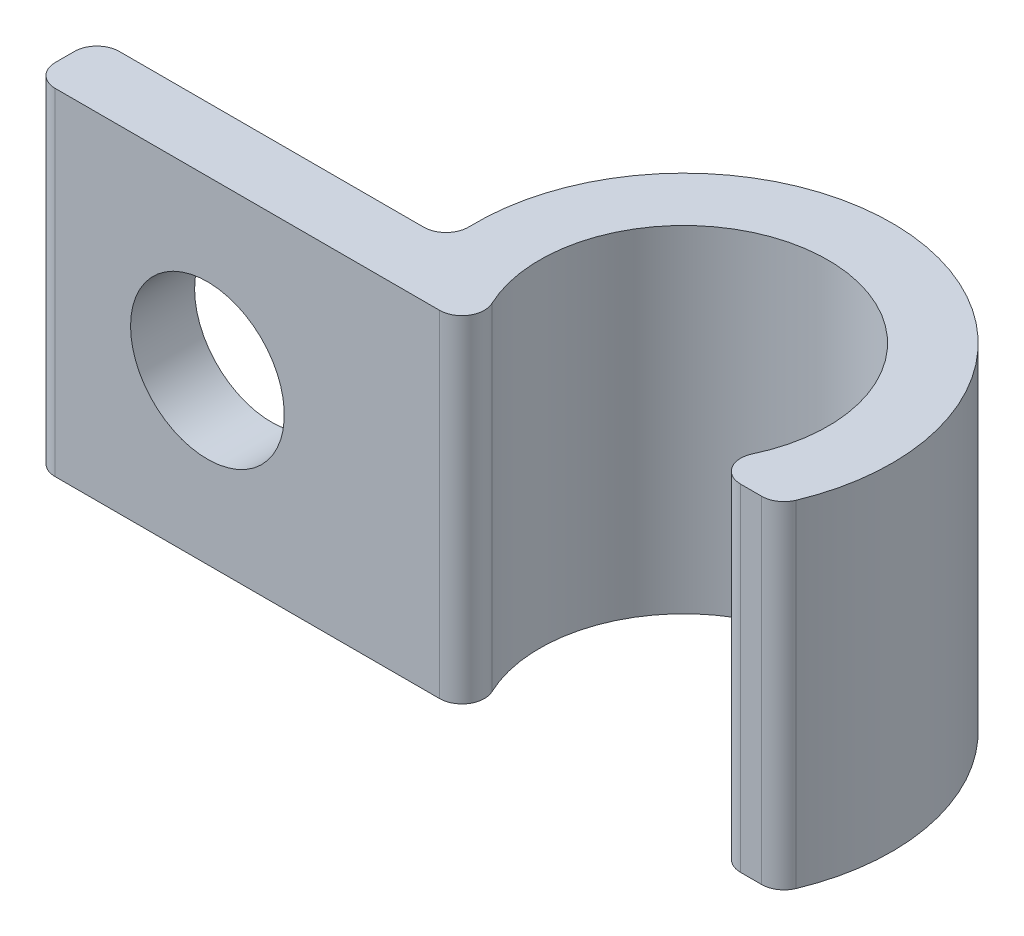
ISO-10303-21;
HEADER;
FILE_DESCRIPTION(('STEP AP214'),'2;1');
FILE_NAME('part.step','',(''),(''),'','','');
FILE_SCHEMA(('AUTOMOTIVE_DESIGN { 1 0 10303 214 1 1 1 1 }'));
ENDSEC;
DATA;
#1=APPLICATION_CONTEXT('core data for automotive mechanical design processes');
#2=APPLICATION_PROTOCOL_DEFINITION('international standard','automotive_design',2000,#1);
#3=PRODUCT_CONTEXT('',#1,'mechanical');
#4=PRODUCT('Part','Part','',(#3));
#5=PRODUCT_RELATED_PRODUCT_CATEGORY('part','',(#4));
#6=PRODUCT_DEFINITION_FORMATION('','',#4);
#7=PRODUCT_DEFINITION_CONTEXT('part definition',#1,'design');
#8=PRODUCT_DEFINITION('design','',#6,#7);
#9=PRODUCT_DEFINITION_SHAPE('','',#8);
#10=(LENGTH_UNIT() NAMED_UNIT(*) SI_UNIT(.MILLI.,.METRE.));
#11=(NAMED_UNIT(*) PLANE_ANGLE_UNIT() SI_UNIT($,.RADIAN.));
#12=(NAMED_UNIT(*) SI_UNIT($,.STERADIAN.) SOLID_ANGLE_UNIT());
#13=UNCERTAINTY_MEASURE_WITH_UNIT(LENGTH_MEASURE(1.E-05),#10,'distance_accuracy_value','');
#14=(GEOMETRIC_REPRESENTATION_CONTEXT(3) GLOBAL_UNCERTAINTY_ASSIGNED_CONTEXT((#13)) GLOBAL_UNIT_ASSIGNED_CONTEXT((#10,
#11,#12)) REPRESENTATION_CONTEXT('',''));
#15=CARTESIAN_POINT('',(0.,0.,0.));
#16=DIRECTION('',(0.,0.,1.));
#17=DIRECTION('',(1.,0.,0.));
#18=AXIS2_PLACEMENT_3D('',#15,#16,#17);
#19=CARTESIAN_POINT('',(12.,10.5,-0.7));
#20=DIRECTION('',(0.,-1.,0.));
#21=DIRECTION('',(0.,0.,-1.));
#22=AXIS2_PLACEMENT_3D('',#19,#20,#21);
#23=CYLINDRICAL_SURFACE('',#22,0.699999999999999);
#24=CARTESIAN_POINT('',(12.,0.,-0.7));
#25=DIRECTION('',(0.,1.,0.));
#26=DIRECTION('',(0.,0.,1.));
#27=AXIS2_PLACEMENT_3D('',#24,#25,#26);
#28=CIRCLE('',#27,0.699999999999999);
#29=CARTESIAN_POINT('',(12.,0.,0.));
#30=VERTEX_POINT('',#29);
#31=CARTESIAN_POINT('',(12.6326923076923,0.,-0.999500323517324));
#32=VERTEX_POINT('',#31);
#33=EDGE_CURVE('E153',#30,#32,#28,.T.);
#34=ORIENTED_EDGE('',*,*,#33,.T.);
#35=DIRECTION('',(0.,-1.,0.));
#36=VECTOR('',#35,1.);
#37=CARTESIAN_POINT('',(12.6326923076923,10.5,-0.999500323517324));
#38=LINE('',#37,#36);
#39=CARTESIAN_POINT('',(12.6326923076923,10.5,-0.999500323517324));
#40=VERTEX_POINT('',#39);
#41=EDGE_CURVE('E11',#40,#32,#38,.T.);
#42=ORIENTED_EDGE('',*,*,#41,.F.);
#43=CARTESIAN_POINT('',(12.,10.5,-0.7));
#44=DIRECTION('',(0.,1.,0.));
#45=DIRECTION('',(0.,0.,1.));
#46=AXIS2_PLACEMENT_3D('',#43,#44,#45);
#47=CIRCLE('',#46,0.699999999999999);
#48=CARTESIAN_POINT('',(12.,10.5,0.));
#49=VERTEX_POINT('',#48);
#50=EDGE_CURVE('E176',#49,#40,#47,.T.);
#51=ORIENTED_EDGE('',*,*,#50,.F.);
#52=DIRECTION('',(0.,-1.,0.));
#53=VECTOR('',#52,1.);
#54=CARTESIAN_POINT('',(12.,10.5,0.));
#55=LINE('',#54,#53);
#56=EDGE_CURVE('E149',#49,#30,#55,.T.);
#57=ORIENTED_EDGE('',*,*,#56,.T.);
#58=EDGE_LOOP('',(#34,#42,#51,#57));
#59=FACE_BOUND('',#58,.T.);
#60=ADVANCED_FACE('F33',(#59),#23,.T.);
#61=CARTESIAN_POINT('',(16.7,10.5,-2.9248595461287));
#62=DIRECTION('',(0.,-1.,0.));
#63=DIRECTION('',(0.,0.,-1.));
#64=AXIS2_PLACEMENT_3D('',#61,#62,#63);
#65=CYLINDRICAL_SURFACE('',#64,4.5);
#66=CARTESIAN_POINT('',(16.7,0.,-2.9248595461287));
#67=DIRECTION('',(0.,-1.,0.));
#68=DIRECTION('',(0.,0.,-1.));
#69=AXIS2_PLACEMENT_3D('',#66,#67,#68);
#70=CIRCLE('',#69,4.5);
#71=CARTESIAN_POINT('',(20.7673076923077,0.,-0.999500323517325));
#72=VERTEX_POINT('',#71);
#73=EDGE_CURVE('E156',#32,#72,#70,.T.);
#74=ORIENTED_EDGE('',*,*,#73,.T.);
#75=DIRECTION('',(0.,-1.,0.));
#76=VECTOR('',#75,1.);
#77=CARTESIAN_POINT('',(20.7673076923077,10.5,-0.999500323517325));
#78=LINE('',#77,#76);
#79=CARTESIAN_POINT('',(20.7673076923077,10.5,-0.999500323517325));
#80=VERTEX_POINT('',#79);
#81=EDGE_CURVE('E41',#80,#72,#78,.T.);
#82=ORIENTED_EDGE('',*,*,#81,.F.);
#83=CARTESIAN_POINT('',(16.7,10.5,-2.9248595461287));
#84=DIRECTION('',(0.,-1.,0.));
#85=DIRECTION('',(0.,0.,-1.));
#86=AXIS2_PLACEMENT_3D('',#83,#84,#85);
#87=CIRCLE('',#86,4.5);
#88=EDGE_CURVE('E104',#40,#80,#87,.T.);
#89=ORIENTED_EDGE('',*,*,#88,.F.);
#90=ORIENTED_EDGE('',*,*,#41,.T.);
#91=EDGE_LOOP('',(#74,#82,#89,#90));
#92=FACE_BOUND('',#91,.T.);
#93=ADVANCED_FACE('F256',(#92),#65,.F.);
#94=CARTESIAN_POINT('',(21.4,10.5,-0.7));
#95=DIRECTION('',(0.,-1.,0.));
#96=DIRECTION('',(0.,0.,-1.));
#97=AXIS2_PLACEMENT_3D('',#94,#95,#96);
#98=CYLINDRICAL_SURFACE('',#97,0.699999999999999);
#99=CARTESIAN_POINT('',(21.4,0.,-0.7));
#100=DIRECTION('',(0.,1.,0.));
#101=DIRECTION('',(0.,0.,1.));
#102=AXIS2_PLACEMENT_3D('',#99,#100,#101);
#103=CIRCLE('',#102,0.699999999999999);
#104=CARTESIAN_POINT('',(21.4,0.,0.));
#105=VERTEX_POINT('',#104);
#106=EDGE_CURVE('E159',#72,#105,#103,.T.);
#107=ORIENTED_EDGE('',*,*,#106,.T.);
#108=DIRECTION('',(0.,-1.,0.));
#109=VECTOR('',#108,1.);
#110=CARTESIAN_POINT('',(21.4,10.5,0.));
#111=LINE('',#110,#109);
#112=CARTESIAN_POINT('',(21.4,10.5,0.));
#113=VERTEX_POINT('',#112);
#114=EDGE_CURVE('E195',#113,#105,#111,.T.);
#115=ORIENTED_EDGE('',*,*,#114,.F.);
#116=CARTESIAN_POINT('',(21.4,10.5,-0.7));
#117=DIRECTION('',(0.,1.,0.));
#118=DIRECTION('',(0.,0.,1.));
#119=AXIS2_PLACEMENT_3D('',#116,#117,#118);
#120=CIRCLE('',#119,0.699999999999999);
#121=EDGE_CURVE('E203',#80,#113,#120,.T.);
#122=ORIENTED_EDGE('',*,*,#121,.F.);
#123=ORIENTED_EDGE('',*,*,#81,.T.);
#124=EDGE_LOOP('',(#107,#115,#122,#123));
#125=FACE_BOUND('',#124,.T.);
#126=ADVANCED_FACE('F201',(#125),#98,.T.);
#127=CARTESIAN_POINT('',(21.4,10.5,0.));
#128=DIRECTION('',(0.,0.,-1.));
#129=DIRECTION('',(-1.,0.,0.));
#130=AXIS2_PLACEMENT_3D('',#127,#128,#129);
#131=PLANE('',#130);
#132=DIRECTION('',(1.,0.,0.));
#133=VECTOR('',#132,1.);
#134=CARTESIAN_POINT('',(21.4,0.,0.));
#135=LINE('',#134,#133);
#136=CARTESIAN_POINT('',(22.0563046963368,0.,0.));
#137=VERTEX_POINT('',#136);
#138=EDGE_CURVE('E161',#105,#137,#135,.T.);
#139=ORIENTED_EDGE('',*,*,#138,.T.);
#140=DIRECTION('',(0.,-1.,0.));
#141=VECTOR('',#140,1.);
#142=CARTESIAN_POINT('',(22.0563046963368,10.5,0.));
#143=LINE('',#142,#141);
#144=CARTESIAN_POINT('',(22.0563046963368,10.5,0.));
#145=VERTEX_POINT('',#144);
#146=EDGE_CURVE('E192',#145,#137,#143,.T.);
#147=ORIENTED_EDGE('',*,*,#146,.F.);
#148=DIRECTION('',(1.,0.,0.));
#149=VECTOR('',#148,1.);
#150=CARTESIAN_POINT('',(21.4,10.5,0.));
#151=LINE('',#150,#149);
#152=EDGE_CURVE('E221',#113,#145,#151,.T.);
#153=ORIENTED_EDGE('',*,*,#152,.F.);
#154=ORIENTED_EDGE('',*,*,#114,.T.);
#155=EDGE_LOOP('',(#139,#147,#153,#154));
#156=FACE_BOUND('',#155,.T.);
#157=ADVANCED_FACE('F212',(#156),#131,.F.);
#158=CARTESIAN_POINT('',(22.0563046963368,10.5,-0.7));
#159=DIRECTION('',(0.,-1.,0.));
#160=DIRECTION('',(0.,0.,-1.));
#161=AXIS2_PLACEMENT_3D('',#158,#159,#160);
#162=CYLINDRICAL_SURFACE('',#161,0.7);
#163=CARTESIAN_POINT('',(22.0563046963368,0.,-0.7));
#164=DIRECTION('',(0.,1.,0.));
#165=DIRECTION('',(0.,0.,1.));
#166=AXIS2_PLACEMENT_3D('',#163,#164,#165);
#167=CIRCLE('',#166,0.7);
#168=CARTESIAN_POINT('',(22.7027552631361,0.,-0.431482468570676));
#169=VERTEX_POINT('',#168);
#170=EDGE_CURVE('E163',#137,#169,#167,.T.);
#171=ORIENTED_EDGE('',*,*,#170,.T.);
#172=DIRECTION('',(0.,-1.,0.));
#173=VECTOR('',#172,1.);
#174=CARTESIAN_POINT('',(22.7027552631361,10.5,-0.431482468570676));
#175=LINE('',#174,#173);
#176=CARTESIAN_POINT('',(22.7027552631361,10.5,-0.431482468570676));
#177=VERTEX_POINT('',#176);
#178=EDGE_CURVE('E189',#177,#169,#175,.T.);
#179=ORIENTED_EDGE('',*,*,#178,.F.);
#180=CARTESIAN_POINT('',(22.0563046963368,10.5,-0.7));
#181=DIRECTION('',(0.,1.,0.));
#182=DIRECTION('',(0.,0.,1.));
#183=AXIS2_PLACEMENT_3D('',#180,#181,#182);
#184=CIRCLE('',#183,0.7);
#185=EDGE_CURVE('E218',#145,#177,#184,.T.);
#186=ORIENTED_EDGE('',*,*,#185,.F.);
#187=ORIENTED_EDGE('',*,*,#146,.T.);
#188=EDGE_LOOP('',(#171,#179,#186,#187));
#189=FACE_BOUND('',#188,.T.);
#190=ADVANCED_FACE('F216',(#189),#162,.T.);
#191=CARTESIAN_POINT('',(16.7,10.5,-2.9248595461287));
#192=DIRECTION('',(0.,-1.,0.));
#193=DIRECTION('',(0.,0.,-1.));
#194=AXIS2_PLACEMENT_3D('',#191,#192,#193);
#195=CYLINDRICAL_SURFACE('',#194,6.5);
#196=CARTESIAN_POINT('',(16.7,0.,-2.9248595461287));
#197=DIRECTION('',(0.,1.,0.));
#198=DIRECTION('',(0.,0.,1.));
#199=AXIS2_PLACEMENT_3D('',#196,#197,#198);
#200=CIRCLE('',#199,6.5);
#201=CARTESIAN_POINT('',(10.203170640209,0.,-2.72186134476251));
#202=VERTEX_POINT('',#201);
#203=EDGE_CURVE('E165',#169,#202,#200,.T.);
#204=ORIENTED_EDGE('',*,*,#203,.T.);
#205=DIRECTION('',(0.,-1.,0.));
#206=VECTOR('',#205,1.);
#207=CARTESIAN_POINT('',(10.203170640209,10.5,-2.72186134476251));
#208=LINE('',#207,#206);
#209=CARTESIAN_POINT('',(10.203170640209,10.5,-2.72186134476251));
#210=VERTEX_POINT('',#209);
#211=EDGE_CURVE('E186',#210,#202,#208,.T.);
#212=ORIENTED_EDGE('',*,*,#211,.F.);
#213=CARTESIAN_POINT('',(16.7,10.5,-2.9248595461287));
#214=DIRECTION('',(0.,1.,0.));
#215=DIRECTION('',(0.,0.,1.));
#216=AXIS2_PLACEMENT_3D('',#213,#214,#215);
#217=CIRCLE('',#216,6.5);
#218=EDGE_CURVE('E220',#177,#210,#217,.T.);
#219=ORIENTED_EDGE('',*,*,#218,.F.);
#220=ORIENTED_EDGE('',*,*,#178,.T.);
#221=EDGE_LOOP('',(#204,#212,#219,#220));
#222=FACE_BOUND('',#221,.T.);
#223=ADVANCED_FACE('F269',(#222),#195,.T.);
#224=CARTESIAN_POINT('',(9.50351209376999,10.5,-2.7));
#225=DIRECTION('',(0.,-1.,0.));
#226=DIRECTION('',(0.,0.,-1.));
#227=AXIS2_PLACEMENT_3D('',#224,#225,#226);
#228=CYLINDRICAL_SURFACE('',#227,0.7);
#229=CARTESIAN_POINT('',(9.50351209376999,0.,-2.7));
#230=DIRECTION('',(0.,-1.,0.));
#231=DIRECTION('',(0.,0.,-1.));
#232=AXIS2_PLACEMENT_3D('',#229,#230,#231);
#233=CIRCLE('',#232,0.7);
#234=CARTESIAN_POINT('',(9.50351209376999,0.,-2.));
#235=VERTEX_POINT('',#234);
#236=EDGE_CURVE('E167',#202,#235,#233,.T.);
#237=ORIENTED_EDGE('',*,*,#236,.T.);
#238=DIRECTION('',(0.,-1.,0.));
#239=VECTOR('',#238,1.);
#240=CARTESIAN_POINT('',(9.50351209376999,10.5,-2.));
#241=LINE('',#240,#239);
#242=CARTESIAN_POINT('',(9.50351209376999,10.5,-2.));
#243=VERTEX_POINT('',#242);
#244=EDGE_CURVE('E183',#243,#235,#241,.T.);
#245=ORIENTED_EDGE('',*,*,#244,.F.);
#246=CARTESIAN_POINT('',(9.50351209376999,10.5,-2.7));
#247=DIRECTION('',(0.,-1.,0.));
#248=DIRECTION('',(0.,0.,-1.));
#249=AXIS2_PLACEMENT_3D('',#246,#247,#248);
#250=CIRCLE('',#249,0.7);
#251=EDGE_CURVE('E223',#210,#243,#250,.T.);
#252=ORIENTED_EDGE('',*,*,#251,.F.);
#253=ORIENTED_EDGE('',*,*,#211,.T.);
#254=EDGE_LOOP('',(#237,#245,#252,#253));
#255=FACE_BOUND('',#254,.T.);
#256=ADVANCED_FACE('F272',(#255),#228,.F.);
#257=CARTESIAN_POINT('',(9.50351209376999,10.5,-2.));
#258=DIRECTION('',(0.,0.,1.));
#259=DIRECTION('',(1.,0.,0.));
#260=AXIS2_PLACEMENT_3D('',#257,#258,#259);
#261=PLANE('',#260);
#262=CARTESIAN_POINT('',(4.751756046885,5.25,-2.));
#263=DIRECTION('',(0.,0.,-1.));
#264=DIRECTION('',(-1.,0.,0.));
#265=AXIS2_PLACEMENT_3D('',#262,#263,#264);
#266=CIRCLE('',#265,2.39999999999999);
#267=CARTESIAN_POINT('',(2.35175604688501,5.25,-2.));
#268=VERTEX_POINT('',#267);
#269=EDGE_CURVE('E334',#268,#268,#266,.T.);
#270=ORIENTED_EDGE('',*,*,#269,.F.);
#271=EDGE_LOOP('',(#270));
#272=FACE_BOUND('',#271,.T.);
#273=DIRECTION('',(-1.,0.,0.));
#274=VECTOR('',#273,1.);
#275=CARTESIAN_POINT('',(9.50351209376999,0.,-2.));
#276=LINE('',#275,#274);
#277=CARTESIAN_POINT('',(0.,0.,-2.));
#278=VERTEX_POINT('',#277);
#279=EDGE_CURVE('E169',#235,#278,#276,.T.);
#280=ORIENTED_EDGE('',*,*,#279,.T.);
#281=DIRECTION('',(0.,-1.,0.));
#282=VECTOR('',#281,1.);
#283=CARTESIAN_POINT('',(0.,10.5,-2.));
#284=LINE('',#283,#282);
#285=CARTESIAN_POINT('',(0.,10.5,-2.));
#286=VERTEX_POINT('',#285);
#287=EDGE_CURVE('E180',#286,#278,#284,.T.);
#288=ORIENTED_EDGE('',*,*,#287,.F.);
#289=DIRECTION('',(-1.,0.,0.));
#290=VECTOR('',#289,1.);
#291=CARTESIAN_POINT('',(9.50351209376999,10.5,-2.));
#292=LINE('',#291,#290);
#293=EDGE_CURVE('E229',#243,#286,#292,.T.);
#294=ORIENTED_EDGE('',*,*,#293,.F.);
#295=ORIENTED_EDGE('',*,*,#244,.T.);
#296=EDGE_LOOP('',(#280,#288,#294,#295));
#297=FACE_BOUND('',#296,.T.);
#298=ADVANCED_FACE('F235',(#272,#297),#261,.F.);
#299=CARTESIAN_POINT('',(0.,10.5,-1.3));
#300=DIRECTION('',(0.,-1.,0.));
#301=DIRECTION('',(0.,0.,-1.));
#302=AXIS2_PLACEMENT_3D('',#299,#300,#301);
#303=CYLINDRICAL_SURFACE('',#302,0.7);
#304=CARTESIAN_POINT('',(0.,0.,-1.3));
#305=DIRECTION('',(0.,1.,0.));
#306=DIRECTION('',(0.,0.,1.));
#307=AXIS2_PLACEMENT_3D('',#304,#305,#306);
#308=CIRCLE('',#307,0.7);
#309=CARTESIAN_POINT('',(-0.7,0.,-1.3));
#310=VERTEX_POINT('',#309);
#311=EDGE_CURVE('E171',#278,#310,#308,.T.);
#312=ORIENTED_EDGE('',*,*,#311,.T.);
#313=DIRECTION('',(0.,-1.,0.));
#314=VECTOR('',#313,1.);
#315=CARTESIAN_POINT('',(-0.7,10.5,-1.3));
#316=LINE('',#315,#314);
#317=CARTESIAN_POINT('',(-0.7,10.5,-1.3));
#318=VERTEX_POINT('',#317);
#319=EDGE_CURVE('E144',#318,#310,#316,.T.);
#320=ORIENTED_EDGE('',*,*,#319,.F.);
#321=CARTESIAN_POINT('',(0.,10.5,-1.3));
#322=DIRECTION('',(0.,1.,0.));
#323=DIRECTION('',(0.,0.,1.));
#324=AXIS2_PLACEMENT_3D('',#321,#322,#323);
#325=CIRCLE('',#324,0.7);
#326=EDGE_CURVE('E135',#286,#318,#325,.T.);
#327=ORIENTED_EDGE('',*,*,#326,.F.);
#328=ORIENTED_EDGE('',*,*,#287,.T.);
#329=EDGE_LOOP('',(#312,#320,#327,#328));
#330=FACE_BOUND('',#329,.T.);
#331=ADVANCED_FACE('F239',(#330),#303,.T.);
#332=CARTESIAN_POINT('',(-0.7,10.5,-1.3));
#333=DIRECTION('',(1.,0.,0.));
#334=DIRECTION('',(0.,0.,-1.));
#335=AXIS2_PLACEMENT_3D('',#332,#333,#334);
#336=PLANE('',#335);
#337=DIRECTION('',(0.,0.,1.));
#338=VECTOR('',#337,1.);
#339=CARTESIAN_POINT('',(-0.7,0.,-1.3));
#340=LINE('',#339,#338);
#341=CARTESIAN_POINT('',(-0.7,0.,-0.7));
#342=VERTEX_POINT('',#341);
#343=EDGE_CURVE('E143',#310,#342,#340,.T.);
#344=ORIENTED_EDGE('',*,*,#343,.T.);
#345=DIRECTION('',(0.,-1.,0.));
#346=VECTOR('',#345,1.);
#347=CARTESIAN_POINT('',(-0.7,10.5,-0.7));
#348=LINE('',#347,#346);
#349=CARTESIAN_POINT('',(-0.7,10.5,-0.7));
#350=VERTEX_POINT('',#349);
#351=EDGE_CURVE('E140',#350,#342,#348,.T.);
#352=ORIENTED_EDGE('',*,*,#351,.F.);
#353=DIRECTION('',(0.,0.,1.));
#354=VECTOR('',#353,1.);
#355=CARTESIAN_POINT('',(-0.7,10.5,-1.3));
#356=LINE('',#355,#354);
#357=EDGE_CURVE('E129',#318,#350,#356,.T.);
#358=ORIENTED_EDGE('',*,*,#357,.F.);
#359=ORIENTED_EDGE('',*,*,#319,.T.);
#360=EDGE_LOOP('',(#344,#352,#358,#359));
#361=FACE_BOUND('',#360,.T.);
#362=ADVANCED_FACE('F141',(#361),#336,.F.);
#363=CARTESIAN_POINT('',(0.,10.5,-0.7));
#364=DIRECTION('',(0.,-1.,0.));
#365=DIRECTION('',(0.,0.,-1.));
#366=AXIS2_PLACEMENT_3D('',#363,#364,#365);
#367=CYLINDRICAL_SURFACE('',#366,0.7);
#368=CARTESIAN_POINT('',(0.,0.,-0.7));
#369=DIRECTION('',(0.,1.,0.));
#370=DIRECTION('',(0.,0.,1.));
#371=AXIS2_PLACEMENT_3D('',#368,#369,#370);
#372=CIRCLE('',#371,0.7);
#373=CARTESIAN_POINT('',(0.,0.,0.));
#374=VERTEX_POINT('',#373);
#375=EDGE_CURVE('E90',#342,#374,#372,.T.);
#376=ORIENTED_EDGE('',*,*,#375,.T.);
#377=DIRECTION('',(0.,-1.,0.));
#378=VECTOR('',#377,1.);
#379=CARTESIAN_POINT('',(0.,10.5,0.));
#380=LINE('',#379,#378);
#381=CARTESIAN_POINT('',(0.,10.5,0.));
#382=VERTEX_POINT('',#381);
#383=EDGE_CURVE('E145',#382,#374,#380,.T.);
#384=ORIENTED_EDGE('',*,*,#383,.F.);
#385=CARTESIAN_POINT('',(0.,10.5,-0.7));
#386=DIRECTION('',(0.,1.,0.));
#387=DIRECTION('',(0.,0.,1.));
#388=AXIS2_PLACEMENT_3D('',#385,#386,#387);
#389=CIRCLE('',#388,0.7);
#390=EDGE_CURVE('E133',#350,#382,#389,.T.);
#391=ORIENTED_EDGE('',*,*,#390,.F.);
#392=ORIENTED_EDGE('',*,*,#351,.T.);
#393=EDGE_LOOP('',(#376,#384,#391,#392));
#394=FACE_BOUND('',#393,.T.);
#395=ADVANCED_FACE('F147',(#394),#367,.T.);
#396=CARTESIAN_POINT('',(0.,10.5,0.));
#397=DIRECTION('',(0.,0.,-1.));
#398=DIRECTION('',(-1.,0.,0.));
#399=AXIS2_PLACEMENT_3D('',#396,#397,#398);
#400=PLANE('',#399);
#401=CARTESIAN_POINT('',(4.751756046885,5.25,0.));
#402=DIRECTION('',(0.,0.,-1.));
#403=DIRECTION('',(-1.,0.,0.));
#404=AXIS2_PLACEMENT_3D('',#401,#402,#403);
#405=CIRCLE('',#404,2.4);
#406=CARTESIAN_POINT('',(2.351756046885,5.25,0.));
#407=VERTEX_POINT('',#406);
#408=EDGE_CURVE('E157',#407,#407,#405,.T.);
#409=ORIENTED_EDGE('',*,*,#408,.T.);
#410=EDGE_LOOP('',(#409));
#411=FACE_BOUND('',#410,.T.);
#412=DIRECTION('',(1.,0.,0.));
#413=VECTOR('',#412,1.);
#414=CARTESIAN_POINT('',(0.,0.,0.));
#415=LINE('',#414,#413);
#416=EDGE_CURVE('E96',#374,#30,#415,.T.);
#417=ORIENTED_EDGE('',*,*,#416,.T.);
#418=ORIENTED_EDGE('',*,*,#56,.F.);
#419=DIRECTION('',(1.,0.,0.));
#420=VECTOR('',#419,1.);
#421=CARTESIAN_POINT('',(0.,10.5,0.));
#422=LINE('',#421,#420);
#423=EDGE_CURVE('E49',#382,#49,#422,.T.);
#424=ORIENTED_EDGE('',*,*,#423,.F.);
#425=ORIENTED_EDGE('',*,*,#383,.T.);
#426=EDGE_LOOP('',(#417,#418,#424,#425));
#427=FACE_BOUND('',#426,.T.);
#428=ADVANCED_FACE('F243',(#411,#427),#400,.F.);
#429=CARTESIAN_POINT('',(12.,10.5,-0.7));
#430=DIRECTION('',(0.,1.,0.));
#431=DIRECTION('',(0.,0.,1.));
#432=AXIS2_PLACEMENT_3D('',#429,#430,#431);
#433=PLANE('',#432);
#434=ORIENTED_EDGE('',*,*,#50,.T.);
#435=ORIENTED_EDGE('',*,*,#88,.T.);
#436=ORIENTED_EDGE('',*,*,#121,.T.);
#437=ORIENTED_EDGE('',*,*,#152,.T.);
#438=ORIENTED_EDGE('',*,*,#185,.T.);
#439=ORIENTED_EDGE('',*,*,#218,.T.);
#440=ORIENTED_EDGE('',*,*,#251,.T.);
#441=ORIENTED_EDGE('',*,*,#293,.T.);
#442=ORIENTED_EDGE('',*,*,#326,.T.);
#443=ORIENTED_EDGE('',*,*,#357,.T.);
#444=ORIENTED_EDGE('',*,*,#390,.T.);
#445=ORIENTED_EDGE('',*,*,#423,.T.);
#446=EDGE_LOOP('',(#434,#435,#436,#437,#438,#439,#440,#441,#442,#443,#444,#445));
#447=FACE_BOUND('',#446,.T.);
#448=ADVANCED_FACE('F131',(#447),#433,.T.);
#449=CARTESIAN_POINT('',(12.,0.,-0.7));
#450=DIRECTION('',(0.,1.,0.));
#451=DIRECTION('',(0.,0.,1.));
#452=AXIS2_PLACEMENT_3D('',#449,#450,#451);
#453=PLANE('',#452);
#454=ORIENTED_EDGE('',*,*,#33,.F.);
#455=ORIENTED_EDGE('',*,*,#416,.F.);
#456=ORIENTED_EDGE('',*,*,#375,.F.);
#457=ORIENTED_EDGE('',*,*,#343,.F.);
#458=ORIENTED_EDGE('',*,*,#311,.F.);
#459=ORIENTED_EDGE('',*,*,#279,.F.);
#460=ORIENTED_EDGE('',*,*,#236,.F.);
#461=ORIENTED_EDGE('',*,*,#203,.F.);
#462=ORIENTED_EDGE('',*,*,#170,.F.);
#463=ORIENTED_EDGE('',*,*,#138,.F.);
#464=ORIENTED_EDGE('',*,*,#106,.F.);
#465=ORIENTED_EDGE('',*,*,#73,.F.);
#466=EDGE_LOOP('',(#454,#455,#456,#457,#458,#459,#460,#461,#462,#463,#464,#465));
#467=FACE_BOUND('',#466,.T.);
#468=ADVANCED_FACE('F207',(#467),#453,.F.);
#469=CARTESIAN_POINT('',(4.751756046885,5.25,-2.));
#470=DIRECTION('',(0.,0.,-1.));
#471=DIRECTION('',(-1.,0.,0.));
#472=AXIS2_PLACEMENT_3D('',#469,#470,#471);
#473=CYLINDRICAL_SURFACE('',#472,2.39999999999999);
#474=ORIENTED_EDGE('',*,*,#408,.F.);
#475=EDGE_LOOP('',(#474));
#476=FACE_BOUND('',#475,.T.);
#477=ORIENTED_EDGE('',*,*,#269,.T.);
#478=EDGE_LOOP('',(#477));
#479=FACE_BOUND('',#478,.T.);
#480=ADVANCED_FACE('F307',(#476,#479),#473,.F.);
#481=CLOSED_SHELL('',(#60,#93,#126,#157,#190,#223,#256,#298,#331,#362,#395,#428,#448,#468,#480));
#482=MANIFOLD_SOLID_BREP('B2',#481);
#483=ADVANCED_BREP_SHAPE_REPRESENTATION('',(#18,#482),#14);
#484=SHAPE_DEFINITION_REPRESENTATION(#9,#483);
ENDSEC;
END-ISO-10303-21;
